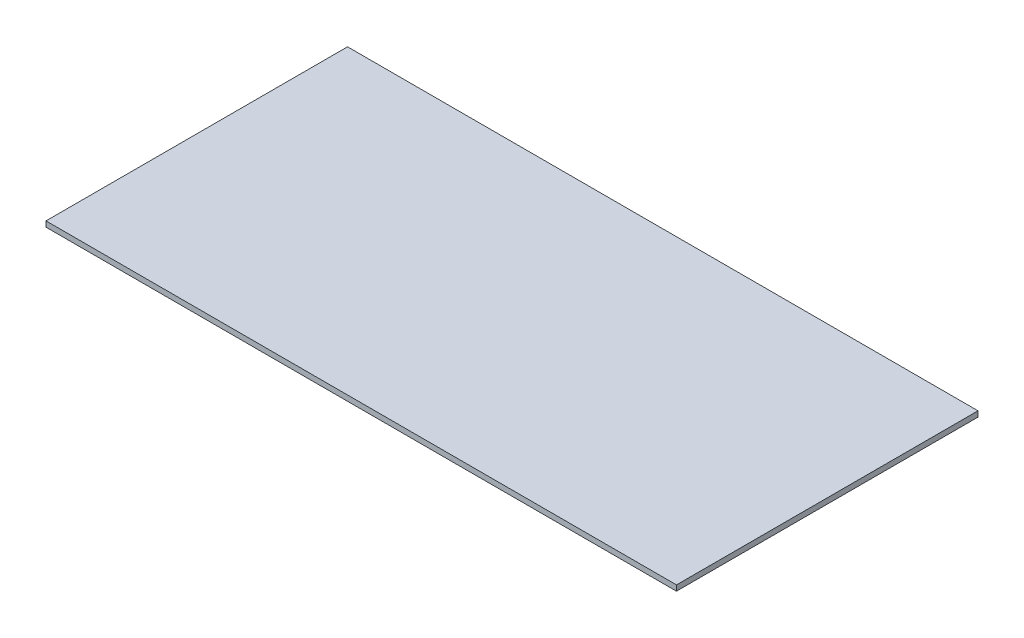
ISO-10303-21;
HEADER;
FILE_DESCRIPTION(('STEP AP214'),'2;1');
FILE_NAME('part.step','',(''),(''),'','','');
FILE_SCHEMA(('AUTOMOTIVE_DESIGN { 1 0 10303 214 1 1 1 1 }'));
ENDSEC;
DATA;
#1=APPLICATION_CONTEXT('core data for automotive mechanical design processes');
#2=APPLICATION_PROTOCOL_DEFINITION('international standard','automotive_design',2000,#1);
#3=PRODUCT_CONTEXT('',#1,'mechanical');
#4=PRODUCT('Part','Part','',(#3));
#5=PRODUCT_RELATED_PRODUCT_CATEGORY('part','',(#4));
#6=PRODUCT_DEFINITION_FORMATION('','',#4);
#7=PRODUCT_DEFINITION_CONTEXT('part definition',#1,'design');
#8=PRODUCT_DEFINITION('design','',#6,#7);
#9=PRODUCT_DEFINITION_SHAPE('','',#8);
#10=(LENGTH_UNIT() NAMED_UNIT(*) SI_UNIT(.MILLI.,.METRE.));
#11=(NAMED_UNIT(*) PLANE_ANGLE_UNIT() SI_UNIT($,.RADIAN.));
#12=(NAMED_UNIT(*) SI_UNIT($,.STERADIAN.) SOLID_ANGLE_UNIT());
#13=UNCERTAINTY_MEASURE_WITH_UNIT(LENGTH_MEASURE(1.E-05),#10,'distance_accuracy_value','');
#14=(GEOMETRIC_REPRESENTATION_CONTEXT(3) GLOBAL_UNCERTAINTY_ASSIGNED_CONTEXT((#13)) GLOBAL_UNIT_ASSIGNED_CONTEXT((#10,
#11,#12)) REPRESENTATION_CONTEXT('',''));
#15=CARTESIAN_POINT('',(0.,0.,0.));
#16=DIRECTION('',(0.,0.,1.));
#17=DIRECTION('',(1.,0.,0.));
#18=AXIS2_PLACEMENT_3D('',#15,#16,#17);
#19=CARTESIAN_POINT('',(0.,5.08,0.));
#20=DIRECTION('',(1.,0.,0.));
#21=DIRECTION('',(0.,0.,-1.));
#22=AXIS2_PLACEMENT_3D('',#19,#20,#21);
#23=PLANE('',#22);
#24=DIRECTION('',(0.,0.,1.));
#25=VECTOR('',#24,1.);
#26=CARTESIAN_POINT('',(0.,0.,0.));
#27=LINE('',#26,#25);
#28=CARTESIAN_POINT('',(0.,0.,-279.4));
#29=VERTEX_POINT('',#28);
#30=CARTESIAN_POINT('',(0.,0.,0.));
#31=VERTEX_POINT('',#30);
#32=EDGE_CURVE('E99',#29,#31,#27,.T.);
#33=ORIENTED_EDGE('',*,*,#32,.T.);
#34=DIRECTION('',(0.,-1.,0.));
#35=VECTOR('',#34,1.);
#36=CARTESIAN_POINT('',(0.,5.08,0.));
#37=LINE('',#36,#35);
#38=CARTESIAN_POINT('',(0.,5.08,0.));
#39=VERTEX_POINT('',#38);
#40=EDGE_CURVE('E11',#39,#31,#37,.T.);
#41=ORIENTED_EDGE('',*,*,#40,.F.);
#42=DIRECTION('',(0.,0.,1.));
#43=VECTOR('',#42,1.);
#44=CARTESIAN_POINT('',(0.,5.08,0.));
#45=LINE('',#44,#43);
#46=CARTESIAN_POINT('',(0.,5.08,-279.4));
#47=VERTEX_POINT('',#46);
#48=EDGE_CURVE('E87',#47,#39,#45,.T.);
#49=ORIENTED_EDGE('',*,*,#48,.F.);
#50=DIRECTION('',(0.,-1.,0.));
#51=VECTOR('',#50,1.);
#52=CARTESIAN_POINT('',(0.,5.08,-279.4));
#53=LINE('',#52,#51);
#54=EDGE_CURVE('E95',#47,#29,#53,.T.);
#55=ORIENTED_EDGE('',*,*,#54,.T.);
#56=EDGE_LOOP('',(#33,#41,#49,#55));
#57=FACE_BOUND('',#56,.T.);
#58=ADVANCED_FACE('F36',(#57),#23,.F.);
#59=CARTESIAN_POINT('',(0.,5.08,0.));
#60=DIRECTION('',(0.,0.,-1.));
#61=DIRECTION('',(-1.,0.,0.));
#62=AXIS2_PLACEMENT_3D('',#59,#60,#61);
#63=PLANE('',#62);
#64=DIRECTION('',(1.,0.,0.));
#65=VECTOR('',#64,1.);
#66=CARTESIAN_POINT('',(0.,0.,0.));
#67=LINE('',#66,#65);
#68=CARTESIAN_POINT('',(584.2,0.,0.));
#69=VERTEX_POINT('',#68);
#70=EDGE_CURVE('E91',#31,#69,#67,.T.);
#71=ORIENTED_EDGE('',*,*,#70,.T.);
#72=DIRECTION('',(0.,-1.,0.));
#73=VECTOR('',#72,1.);
#74=CARTESIAN_POINT('',(584.2,5.08,0.));
#75=LINE('',#74,#73);
#76=CARTESIAN_POINT('',(584.2,5.08,0.));
#77=VERTEX_POINT('',#76);
#78=EDGE_CURVE('E44',#77,#69,#75,.T.);
#79=ORIENTED_EDGE('',*,*,#78,.F.);
#80=DIRECTION('',(1.,0.,0.));
#81=VECTOR('',#80,1.);
#82=CARTESIAN_POINT('',(0.,5.08,0.));
#83=LINE('',#82,#81);
#84=EDGE_CURVE('E82',#39,#77,#83,.T.);
#85=ORIENTED_EDGE('',*,*,#84,.F.);
#86=ORIENTED_EDGE('',*,*,#40,.T.);
#87=EDGE_LOOP('',(#71,#79,#85,#86));
#88=FACE_BOUND('',#87,.T.);
#89=ADVANCED_FACE('F90',(#88),#63,.F.);
#90=CARTESIAN_POINT('',(584.2,5.08,0.));
#91=DIRECTION('',(-1.,0.,0.));
#92=DIRECTION('',(0.,0.,1.));
#93=AXIS2_PLACEMENT_3D('',#90,#91,#92);
#94=PLANE('',#93);
#95=DIRECTION('',(0.,0.,-1.));
#96=VECTOR('',#95,1.);
#97=CARTESIAN_POINT('',(584.2,0.,0.));
#98=LINE('',#97,#96);
#99=CARTESIAN_POINT('',(584.2,0.,-279.4));
#100=VERTEX_POINT('',#99);
#101=EDGE_CURVE('E69',#69,#100,#98,.T.);
#102=ORIENTED_EDGE('',*,*,#101,.T.);
#103=DIRECTION('',(0.,-1.,0.));
#104=VECTOR('',#103,1.);
#105=CARTESIAN_POINT('',(584.2,5.08,-279.4));
#106=LINE('',#105,#104);
#107=CARTESIAN_POINT('',(584.2,5.08,-279.4));
#108=VERTEX_POINT('',#107);
#109=EDGE_CURVE('E92',#108,#100,#106,.T.);
#110=ORIENTED_EDGE('',*,*,#109,.F.);
#111=DIRECTION('',(0.,0.,-1.));
#112=VECTOR('',#111,1.);
#113=CARTESIAN_POINT('',(584.2,5.08,0.));
#114=LINE('',#113,#112);
#115=EDGE_CURVE('E85',#77,#108,#114,.T.);
#116=ORIENTED_EDGE('',*,*,#115,.F.);
#117=ORIENTED_EDGE('',*,*,#78,.T.);
#118=EDGE_LOOP('',(#102,#110,#116,#117));
#119=FACE_BOUND('',#118,.T.);
#120=ADVANCED_FACE('F93',(#119),#94,.F.);
#121=CARTESIAN_POINT('',(0.,5.08,-279.4));
#122=DIRECTION('',(0.,0.,1.));
#123=DIRECTION('',(1.,0.,0.));
#124=AXIS2_PLACEMENT_3D('',#121,#122,#123);
#125=PLANE('',#124);
#126=DIRECTION('',(-1.,0.,0.));
#127=VECTOR('',#126,1.);
#128=CARTESIAN_POINT('',(0.,0.,-279.4));
#129=LINE('',#128,#127);
#130=EDGE_CURVE('E75',#100,#29,#129,.T.);
#131=ORIENTED_EDGE('',*,*,#130,.T.);
#132=ORIENTED_EDGE('',*,*,#54,.F.);
#133=DIRECTION('',(-1.,0.,0.));
#134=VECTOR('',#133,1.);
#135=CARTESIAN_POINT('',(0.,5.08,-279.4));
#136=LINE('',#135,#134);
#137=EDGE_CURVE('E52',#108,#47,#136,.T.);
#138=ORIENTED_EDGE('',*,*,#137,.F.);
#139=ORIENTED_EDGE('',*,*,#109,.T.);
#140=EDGE_LOOP('',(#131,#132,#138,#139));
#141=FACE_BOUND('',#140,.T.);
#142=ADVANCED_FACE('F106',(#141),#125,.F.);
#143=CARTESIAN_POINT('',(0.,5.08,0.));
#144=DIRECTION('',(0.,-1.,0.));
#145=DIRECTION('',(0.,0.,-1.));
#146=AXIS2_PLACEMENT_3D('',#143,#144,#145);
#147=PLANE('',#146);
#148=ORIENTED_EDGE('',*,*,#48,.T.);
#149=ORIENTED_EDGE('',*,*,#84,.T.);
#150=ORIENTED_EDGE('',*,*,#115,.T.);
#151=ORIENTED_EDGE('',*,*,#137,.T.);
#152=EDGE_LOOP('',(#148,#149,#150,#151));
#153=FACE_BOUND('',#152,.T.);
#154=ADVANCED_FACE('F83',(#153),#147,.F.);
#155=CARTESIAN_POINT('',(0.,0.,0.));
#156=DIRECTION('',(0.,-1.,0.));
#157=DIRECTION('',(0.,0.,-1.));
#158=AXIS2_PLACEMENT_3D('',#155,#156,#157);
#159=PLANE('',#158);
#160=ORIENTED_EDGE('',*,*,#32,.F.);
#161=ORIENTED_EDGE('',*,*,#130,.F.);
#162=ORIENTED_EDGE('',*,*,#101,.F.);
#163=ORIENTED_EDGE('',*,*,#70,.F.);
#164=EDGE_LOOP('',(#160,#161,#162,#163));
#165=FACE_BOUND('',#164,.T.);
#166=ADVANCED_FACE('F109',(#165),#159,.T.);
#167=CLOSED_SHELL('',(#58,#89,#120,#142,#154,#166));
#168=MANIFOLD_SOLID_BREP('B2',#167);
#169=ADVANCED_BREP_SHAPE_REPRESENTATION('',(#18,#168),#14);
#170=SHAPE_DEFINITION_REPRESENTATION(#9,#169);
ENDSEC;
END-ISO-10303-21;
